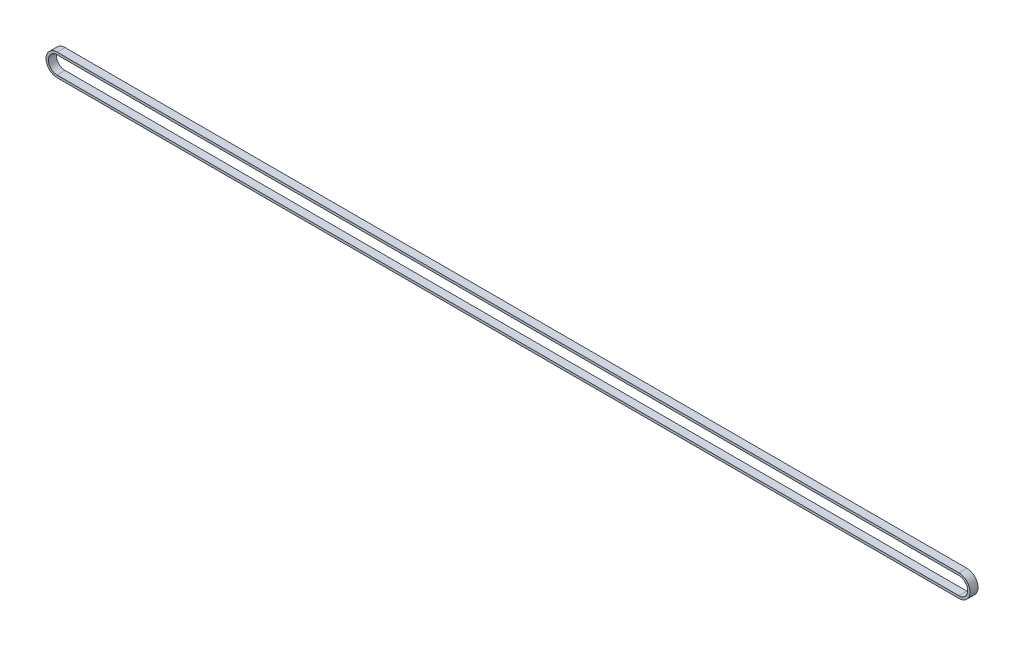
ISO-10303-21;
HEADER;
FILE_DESCRIPTION(('STEP AP214'),'2;1');
FILE_NAME('part.step','',(''),(''),'','','');
FILE_SCHEMA(('AUTOMOTIVE_DESIGN { 1 0 10303 214 1 1 1 1 }'));
ENDSEC;
DATA;
#1=APPLICATION_CONTEXT('core data for automotive mechanical design processes');
#2=APPLICATION_PROTOCOL_DEFINITION('international standard','automotive_design',2000,#1);
#3=PRODUCT_CONTEXT('',#1,'mechanical');
#4=PRODUCT('Part','Part','',(#3));
#5=PRODUCT_RELATED_PRODUCT_CATEGORY('part','',(#4));
#6=PRODUCT_DEFINITION_FORMATION('','',#4);
#7=PRODUCT_DEFINITION_CONTEXT('part definition',#1,'design');
#8=PRODUCT_DEFINITION('design','',#6,#7);
#9=PRODUCT_DEFINITION_SHAPE('','',#8);
#10=(LENGTH_UNIT() NAMED_UNIT(*) SI_UNIT(.MILLI.,.METRE.));
#11=(NAMED_UNIT(*) PLANE_ANGLE_UNIT() SI_UNIT($,.RADIAN.));
#12=(NAMED_UNIT(*) SI_UNIT($,.STERADIAN.) SOLID_ANGLE_UNIT());
#13=UNCERTAINTY_MEASURE_WITH_UNIT(LENGTH_MEASURE(1.E-05),#10,'distance_accuracy_value','');
#14=(GEOMETRIC_REPRESENTATION_CONTEXT(3) GLOBAL_UNCERTAINTY_ASSIGNED_CONTEXT((#13)) GLOBAL_UNIT_ASSIGNED_CONTEXT((#10,
#11,#12)) REPRESENTATION_CONTEXT('',''));
#15=CARTESIAN_POINT('',(0.,0.,0.));
#16=DIRECTION('',(0.,0.,1.));
#17=DIRECTION('',(1.,0.,0.));
#18=AXIS2_PLACEMENT_3D('',#15,#16,#17);
#19=CARTESIAN_POINT('',(284.,1.35713552363461E-13,-2.5));
#20=DIRECTION('',(0.,0.,1.));
#21=DIRECTION('',(1.,0.,0.));
#22=AXIS2_PLACEMENT_3D('',#19,#20,#21);
#23=CYLINDRICAL_SURFACE('',#22,6.99999999999989);
#24=DIRECTION('',(0.,0.,1.));
#25=VECTOR('',#24,1.);
#26=CARTESIAN_POINT('',(284.,7.00000000000003,-2.5));
#27=LINE('',#26,#25);
#28=CARTESIAN_POINT('',(284.,7.00000000000003,-2.5));
#29=VERTEX_POINT('',#28);
#30=CARTESIAN_POINT('',(284.,7.00000000000003,2.5));
#31=VERTEX_POINT('',#30);
#32=EDGE_CURVE('E36',#29,#31,#27,.T.);
#33=ORIENTED_EDGE('',*,*,#32,.T.);
#34=CARTESIAN_POINT('',(284.,1.35713552363461E-13,2.5));
#35=DIRECTION('',(0.,0.,1.));
#36=DIRECTION('',(1.,0.,0.));
#37=AXIS2_PLACEMENT_3D('',#34,#35,#36);
#38=CIRCLE('',#37,6.99999999999989);
#39=CARTESIAN_POINT('',(284.,-6.99999999999976,2.5));
#40=VERTEX_POINT('',#39);
#41=EDGE_CURVE('E128',#40,#31,#38,.T.);
#42=ORIENTED_EDGE('',*,*,#41,.F.);
#43=DIRECTION('',(0.,0.,1.));
#44=VECTOR('',#43,1.);
#45=CARTESIAN_POINT('',(284.,-6.99999999999976,-2.5));
#46=LINE('',#45,#44);
#47=CARTESIAN_POINT('',(284.,-6.99999999999976,-2.5));
#48=VERTEX_POINT('',#47);
#49=EDGE_CURVE('E11',#48,#40,#46,.T.);
#50=ORIENTED_EDGE('',*,*,#49,.F.);
#51=CARTESIAN_POINT('',(284.,1.35713552363461E-13,-2.5));
#52=DIRECTION('',(0.,0.,1.));
#53=DIRECTION('',(1.,0.,0.));
#54=AXIS2_PLACEMENT_3D('',#51,#52,#53);
#55=CIRCLE('',#54,6.99999999999989);
#56=EDGE_CURVE('E147',#48,#29,#55,.T.);
#57=ORIENTED_EDGE('',*,*,#56,.T.);
#58=EDGE_LOOP('',(#33,#42,#50,#57));
#59=FACE_BOUND('',#58,.T.);
#60=ADVANCED_FACE('F33',(#59),#23,.T.);
#61=CARTESIAN_POINT('',(284.,-6.99999999999976,-2.5));
#62=DIRECTION('',(0.,-1.,0.));
#63=DIRECTION('',(1.,0.,0.));
#64=AXIS2_PLACEMENT_3D('',#61,#62,#63);
#65=PLANE('',#64);
#66=ORIENTED_EDGE('',*,*,#49,.T.);
#67=DIRECTION('',(1.,0.,0.));
#68=VECTOR('',#67,1.);
#69=CARTESIAN_POINT('',(284.,-6.99999999999976,2.5));
#70=LINE('',#69,#68);
#71=CARTESIAN_POINT('',(-284.,-6.99999999999993,2.5));
#72=VERTEX_POINT('',#71);
#73=EDGE_CURVE('E137',#72,#40,#70,.T.);
#74=ORIENTED_EDGE('',*,*,#73,.F.);
#75=DIRECTION('',(0.,0.,1.));
#76=VECTOR('',#75,1.);
#77=CARTESIAN_POINT('',(-284.,-6.99999999999993,-2.5));
#78=LINE('',#77,#76);
#79=CARTESIAN_POINT('',(-284.,-6.99999999999993,-2.5));
#80=VERTEX_POINT('',#79);
#81=EDGE_CURVE('E41',#80,#72,#78,.T.);
#82=ORIENTED_EDGE('',*,*,#81,.F.);
#83=DIRECTION('',(1.,0.,0.));
#84=VECTOR('',#83,1.);
#85=CARTESIAN_POINT('',(284.,-6.99999999999976,-2.5));
#86=LINE('',#85,#84);
#87=EDGE_CURVE('E158',#80,#48,#86,.T.);
#88=ORIENTED_EDGE('',*,*,#87,.T.);
#89=EDGE_LOOP('',(#66,#74,#82,#88));
#90=FACE_BOUND('',#89,.T.);
#91=ADVANCED_FACE('F170',(#90),#65,.T.);
#92=CARTESIAN_POINT('',(-284.,0.,-2.5));
#93=DIRECTION('',(0.,0.,1.));
#94=DIRECTION('',(1.,0.,0.));
#95=AXIS2_PLACEMENT_3D('',#92,#93,#94);
#96=CYLINDRICAL_SURFACE('',#95,6.99999999999989);
#97=ORIENTED_EDGE('',*,*,#81,.T.);
#98=CARTESIAN_POINT('',(-284.,0.,2.5));
#99=DIRECTION('',(0.,0.,1.));
#100=DIRECTION('',(1.,0.,0.));
#101=AXIS2_PLACEMENT_3D('',#98,#99,#100);
#102=CIRCLE('',#101,6.99999999999989);
#103=CARTESIAN_POINT('',(-284.,6.99999999999986,2.5));
#104=VERTEX_POINT('',#103);
#105=EDGE_CURVE('E134',#104,#72,#102,.T.);
#106=ORIENTED_EDGE('',*,*,#105,.F.);
#107=DIRECTION('',(0.,0.,1.));
#108=VECTOR('',#107,1.);
#109=CARTESIAN_POINT('',(-284.,6.99999999999986,-2.5));
#110=LINE('',#109,#108);
#111=CARTESIAN_POINT('',(-284.,6.99999999999986,-2.5));
#112=VERTEX_POINT('',#111);
#113=EDGE_CURVE('E161',#112,#104,#110,.T.);
#114=ORIENTED_EDGE('',*,*,#113,.F.);
#115=CARTESIAN_POINT('',(-284.,0.,-2.5));
#116=DIRECTION('',(0.,0.,1.));
#117=DIRECTION('',(1.,0.,0.));
#118=AXIS2_PLACEMENT_3D('',#115,#116,#117);
#119=CIRCLE('',#118,6.99999999999989);
#120=EDGE_CURVE('E155',#112,#80,#119,.T.);
#121=ORIENTED_EDGE('',*,*,#120,.T.);
#122=EDGE_LOOP('',(#97,#106,#114,#121));
#123=FACE_BOUND('',#122,.T.);
#124=ADVANCED_FACE('F176',(#123),#96,.T.);
#125=CARTESIAN_POINT('',(284.,7.00000000000003,-2.5));
#126=DIRECTION('',(0.,1.,0.));
#127=DIRECTION('',(-1.,0.,0.));
#128=AXIS2_PLACEMENT_3D('',#125,#126,#127);
#129=PLANE('',#128);
#130=ORIENTED_EDGE('',*,*,#113,.T.);
#131=DIRECTION('',(-1.,0.,0.));
#132=VECTOR('',#131,1.);
#133=CARTESIAN_POINT('',(284.,7.00000000000003,2.5));
#134=LINE('',#133,#132);
#135=EDGE_CURVE('E131',#31,#104,#134,.T.);
#136=ORIENTED_EDGE('',*,*,#135,.F.);
#137=ORIENTED_EDGE('',*,*,#32,.F.);
#138=DIRECTION('',(-1.,0.,0.));
#139=VECTOR('',#138,1.);
#140=CARTESIAN_POINT('',(284.,7.00000000000003,-2.5));
#141=LINE('',#140,#139);
#142=EDGE_CURVE('E152',#29,#112,#141,.T.);
#143=ORIENTED_EDGE('',*,*,#142,.T.);
#144=EDGE_LOOP('',(#130,#136,#137,#143));
#145=FACE_BOUND('',#144,.T.);
#146=ADVANCED_FACE('F165',(#145),#129,.T.);
#147=CARTESIAN_POINT('',(284.,1.35713552363461E-13,-2.5));
#148=DIRECTION('',(0.,0.,1.));
#149=DIRECTION('',(1.,0.,0.));
#150=AXIS2_PLACEMENT_3D('',#147,#148,#149);
#151=PLANE('',#150);
#152=DIRECTION('',(-1.,0.,0.));
#153=VECTOR('',#152,1.);
#154=CARTESIAN_POINT('',(-284.,5.5000000000001,-2.5));
#155=LINE('',#154,#153);
#156=CARTESIAN_POINT('',(284.,5.50000000000021,-2.5));
#157=VERTEX_POINT('',#156);
#158=CARTESIAN_POINT('',(-284.,5.5000000000001,-2.5));
#159=VERTEX_POINT('',#158);
#160=EDGE_CURVE('E110',#157,#159,#155,.T.);
#161=ORIENTED_EDGE('',*,*,#160,.T.);
#162=CARTESIAN_POINT('',(-284.,0.,-2.5));
#163=DIRECTION('',(0.,0.,1.));
#164=DIRECTION('',(1.,0.,0.));
#165=AXIS2_PLACEMENT_3D('',#162,#163,#164);
#166=CIRCLE('',#165,5.5000000000001);
#167=CARTESIAN_POINT('',(-284.,-5.5000000000001,-2.5));
#168=VERTEX_POINT('',#167);
#169=EDGE_CURVE('E140',#159,#168,#166,.T.);
#170=ORIENTED_EDGE('',*,*,#169,.T.);
#171=DIRECTION('',(1.,0.,0.));
#172=VECTOR('',#171,1.);
#173=CARTESIAN_POINT('',(-284.,-5.5000000000001,-2.5));
#174=LINE('',#173,#172);
#175=CARTESIAN_POINT('',(284.,-5.5,-2.5));
#176=VERTEX_POINT('',#175);
#177=EDGE_CURVE('E105',#168,#176,#174,.T.);
#178=ORIENTED_EDGE('',*,*,#177,.T.);
#179=CARTESIAN_POINT('',(284.,1.04339907287354E-13,-2.5));
#180=DIRECTION('',(0.,0.,1.));
#181=DIRECTION('',(1.,0.,0.));
#182=AXIS2_PLACEMENT_3D('',#179,#180,#181);
#183=CIRCLE('',#182,5.5000000000001);
#184=EDGE_CURVE('E49',#176,#157,#183,.T.);
#185=ORIENTED_EDGE('',*,*,#184,.T.);
#186=EDGE_LOOP('',(#161,#170,#178,#185));
#187=FACE_BOUND('',#186,.T.);
#188=ORIENTED_EDGE('',*,*,#56,.F.);
#189=ORIENTED_EDGE('',*,*,#87,.F.);
#190=ORIENTED_EDGE('',*,*,#120,.F.);
#191=ORIENTED_EDGE('',*,*,#142,.F.);
#192=EDGE_LOOP('',(#188,#189,#190,#191));
#193=FACE_BOUND('',#192,.T.);
#194=ADVANCED_FACE('F174',(#187,#193),#151,.F.);
#195=CARTESIAN_POINT('',(-284.,0.,-2.5));
#196=DIRECTION('',(0.,0.,1.));
#197=DIRECTION('',(1.,0.,0.));
#198=AXIS2_PLACEMENT_3D('',#195,#196,#197);
#199=CYLINDRICAL_SURFACE('',#198,5.5000000000001);
#200=DIRECTION('',(0.,0.,1.));
#201=VECTOR('',#200,1.);
#202=CARTESIAN_POINT('',(-284.,5.5000000000001,-2.5));
#203=LINE('',#202,#201);
#204=CARTESIAN_POINT('',(-284.,5.5000000000001,2.5));
#205=VERTEX_POINT('',#204);
#206=EDGE_CURVE('E115',#159,#205,#203,.T.);
#207=ORIENTED_EDGE('',*,*,#206,.T.);
#208=CARTESIAN_POINT('',(-284.,0.,2.5));
#209=DIRECTION('',(0.,0.,1.));
#210=DIRECTION('',(1.,0.,0.));
#211=AXIS2_PLACEMENT_3D('',#208,#209,#210);
#212=CIRCLE('',#211,5.5000000000001);
#213=CARTESIAN_POINT('',(-284.,-5.5000000000001,2.5));
#214=VERTEX_POINT('',#213);
#215=EDGE_CURVE('E113',#205,#214,#212,.T.);
#216=ORIENTED_EDGE('',*,*,#215,.T.);
#217=DIRECTION('',(0.,0.,1.));
#218=VECTOR('',#217,1.);
#219=CARTESIAN_POINT('',(-284.,-5.5000000000001,-2.5));
#220=LINE('',#219,#218);
#221=EDGE_CURVE('E98',#168,#214,#220,.T.);
#222=ORIENTED_EDGE('',*,*,#221,.F.);
#223=ORIENTED_EDGE('',*,*,#169,.F.);
#224=EDGE_LOOP('',(#207,#216,#222,#223));
#225=FACE_BOUND('',#224,.T.);
#226=ADVANCED_FACE('F114',(#225),#199,.F.);
#227=CARTESIAN_POINT('',(-284.,5.5000000000001,-2.5));
#228=DIRECTION('',(0.,1.,0.));
#229=DIRECTION('',(-1.,0.,0.));
#230=AXIS2_PLACEMENT_3D('',#227,#228,#229);
#231=PLANE('',#230);
#232=DIRECTION('',(0.,0.,1.));
#233=VECTOR('',#232,1.);
#234=CARTESIAN_POINT('',(284.,5.50000000000021,-2.5));
#235=LINE('',#234,#233);
#236=CARTESIAN_POINT('',(284.,5.50000000000021,2.5));
#237=VERTEX_POINT('',#236);
#238=EDGE_CURVE('E148',#157,#237,#235,.T.);
#239=ORIENTED_EDGE('',*,*,#238,.T.);
#240=DIRECTION('',(-1.,0.,0.));
#241=VECTOR('',#240,1.);
#242=CARTESIAN_POINT('',(-284.,5.5000000000001,2.5));
#243=LINE('',#242,#241);
#244=EDGE_CURVE('E124',#237,#205,#243,.T.);
#245=ORIENTED_EDGE('',*,*,#244,.T.);
#246=ORIENTED_EDGE('',*,*,#206,.F.);
#247=ORIENTED_EDGE('',*,*,#160,.F.);
#248=EDGE_LOOP('',(#239,#245,#246,#247));
#249=FACE_BOUND('',#248,.T.);
#250=ADVANCED_FACE('F219',(#249),#231,.F.);
#251=CARTESIAN_POINT('',(284.,1.04339907287354E-13,-2.5));
#252=DIRECTION('',(0.,0.,1.));
#253=DIRECTION('',(1.,0.,0.));
#254=AXIS2_PLACEMENT_3D('',#251,#252,#253);
#255=CYLINDRICAL_SURFACE('',#254,5.5000000000001);
#256=DIRECTION('',(0.,0.,1.));
#257=VECTOR('',#256,1.);
#258=CARTESIAN_POINT('',(284.,-5.5,-2.5));
#259=LINE('',#258,#257);
#260=CARTESIAN_POINT('',(284.,-5.5,2.5));
#261=VERTEX_POINT('',#260);
#262=EDGE_CURVE('E109',#176,#261,#259,.T.);
#263=ORIENTED_EDGE('',*,*,#262,.T.);
#264=CARTESIAN_POINT('',(284.,1.04339907287354E-13,2.5));
#265=DIRECTION('',(0.,0.,1.));
#266=DIRECTION('',(1.,0.,0.));
#267=AXIS2_PLACEMENT_3D('',#264,#265,#266);
#268=CIRCLE('',#267,5.5000000000001);
#269=EDGE_CURVE('E122',#261,#237,#268,.T.);
#270=ORIENTED_EDGE('',*,*,#269,.T.);
#271=ORIENTED_EDGE('',*,*,#238,.F.);
#272=ORIENTED_EDGE('',*,*,#184,.F.);
#273=EDGE_LOOP('',(#263,#270,#271,#272));
#274=FACE_BOUND('',#273,.T.);
#275=ADVANCED_FACE('F228',(#274),#255,.F.);
#276=CARTESIAN_POINT('',(-284.,-5.5000000000001,-2.5));
#277=DIRECTION('',(0.,-1.,0.));
#278=DIRECTION('',(1.,0.,0.));
#279=AXIS2_PLACEMENT_3D('',#276,#277,#278);
#280=PLANE('',#279);
#281=ORIENTED_EDGE('',*,*,#221,.T.);
#282=DIRECTION('',(1.,0.,0.));
#283=VECTOR('',#282,1.);
#284=CARTESIAN_POINT('',(-284.,-5.5000000000001,2.5));
#285=LINE('',#284,#283);
#286=EDGE_CURVE('E102',#214,#261,#285,.T.);
#287=ORIENTED_EDGE('',*,*,#286,.T.);
#288=ORIENTED_EDGE('',*,*,#262,.F.);
#289=ORIENTED_EDGE('',*,*,#177,.F.);
#290=EDGE_LOOP('',(#281,#287,#288,#289));
#291=FACE_BOUND('',#290,.T.);
#292=ADVANCED_FACE('F100',(#291),#280,.F.);
#293=CARTESIAN_POINT('',(284.,1.35713552363461E-13,2.5));
#294=DIRECTION('',(0.,0.,1.));
#295=DIRECTION('',(1.,0.,0.));
#296=AXIS2_PLACEMENT_3D('',#293,#294,#295);
#297=PLANE('',#296);
#298=ORIENTED_EDGE('',*,*,#41,.T.);
#299=ORIENTED_EDGE('',*,*,#135,.T.);
#300=ORIENTED_EDGE('',*,*,#105,.T.);
#301=ORIENTED_EDGE('',*,*,#73,.T.);
#302=EDGE_LOOP('',(#298,#299,#300,#301));
#303=FACE_BOUND('',#302,.T.);
#304=ORIENTED_EDGE('',*,*,#286,.F.);
#305=ORIENTED_EDGE('',*,*,#215,.F.);
#306=ORIENTED_EDGE('',*,*,#244,.F.);
#307=ORIENTED_EDGE('',*,*,#269,.F.);
#308=EDGE_LOOP('',(#304,#305,#306,#307));
#309=FACE_BOUND('',#308,.T.);
#310=ADVANCED_FACE('F120',(#303,#309),#297,.T.);
#311=CLOSED_SHELL('',(#60,#91,#124,#146,#194,#226,#250,#275,#292,#310));
#312=MANIFOLD_SOLID_BREP('B2',#311);
#313=ADVANCED_BREP_SHAPE_REPRESENTATION('',(#18,#312),#14);
#314=SHAPE_DEFINITION_REPRESENTATION(#9,#313);
ENDSEC;
END-ISO-10303-21;
